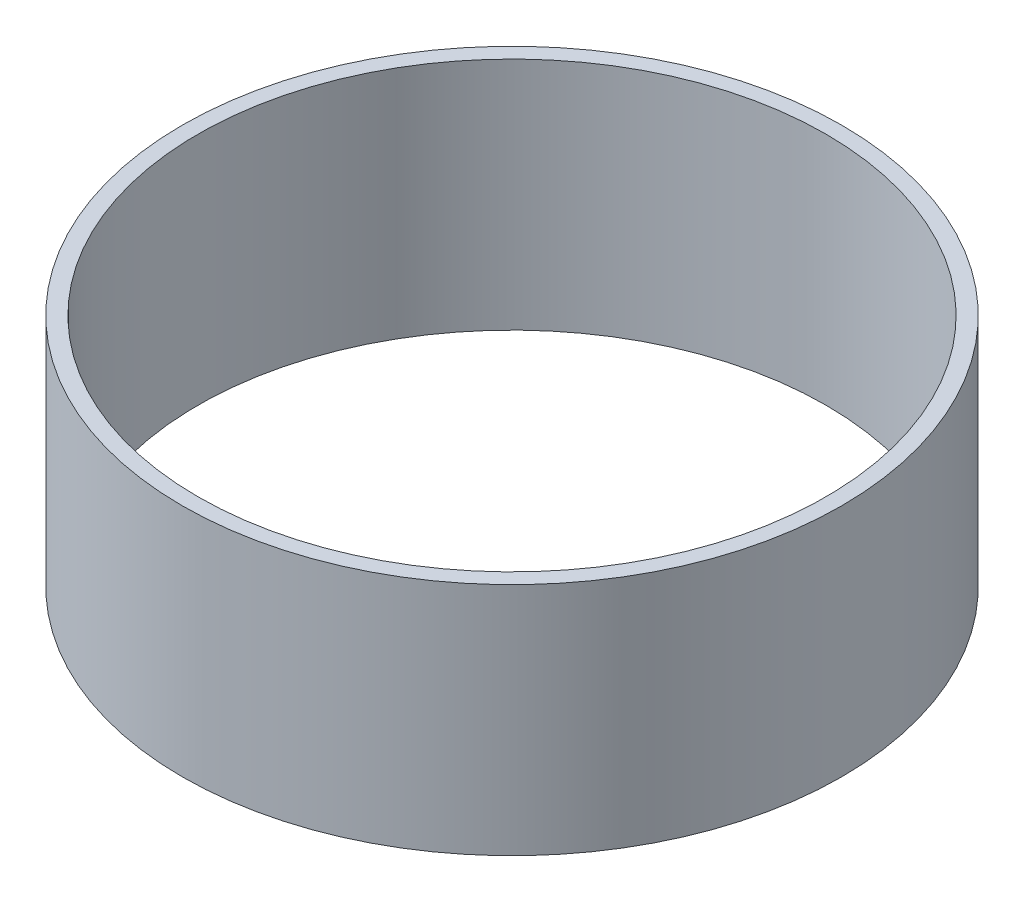
ISO-10303-21;
HEADER;
FILE_DESCRIPTION(('STEP AP214'),'2;1');
FILE_NAME('part.step','',(''),(''),'','','');
FILE_SCHEMA(('AUTOMOTIVE_DESIGN { 1 0 10303 214 1 1 1 1 }'));
ENDSEC;
DATA;
#1=APPLICATION_CONTEXT('core data for automotive mechanical design processes');
#2=APPLICATION_PROTOCOL_DEFINITION('international standard','automotive_design',2000,#1);
#3=PRODUCT_CONTEXT('',#1,'mechanical');
#4=PRODUCT('Part','Part','',(#3));
#5=PRODUCT_RELATED_PRODUCT_CATEGORY('part','',(#4));
#6=PRODUCT_DEFINITION_FORMATION('','',#4);
#7=PRODUCT_DEFINITION_CONTEXT('part definition',#1,'design');
#8=PRODUCT_DEFINITION('design','',#6,#7);
#9=PRODUCT_DEFINITION_SHAPE('','',#8);
#10=(LENGTH_UNIT() NAMED_UNIT(*) SI_UNIT(.MILLI.,.METRE.));
#11=(NAMED_UNIT(*) PLANE_ANGLE_UNIT() SI_UNIT($,.RADIAN.));
#12=(NAMED_UNIT(*) SI_UNIT($,.STERADIAN.) SOLID_ANGLE_UNIT());
#13=UNCERTAINTY_MEASURE_WITH_UNIT(LENGTH_MEASURE(1.E-05),#10,'distance_accuracy_value','');
#14=(GEOMETRIC_REPRESENTATION_CONTEXT(3) GLOBAL_UNCERTAINTY_ASSIGNED_CONTEXT((#13)) GLOBAL_UNIT_ASSIGNED_CONTEXT((#10,
#11,#12)) REPRESENTATION_CONTEXT('',''));
#15=CARTESIAN_POINT('',(0.,0.,0.));
#16=DIRECTION('',(0.,0.,1.));
#17=DIRECTION('',(1.,0.,0.));
#18=AXIS2_PLACEMENT_3D('',#15,#16,#17);
#19=CARTESIAN_POINT('',(0.,15.,0.));
#20=DIRECTION('',(0.,1.,0.));
#21=DIRECTION('',(0.,0.,1.));
#22=AXIS2_PLACEMENT_3D('',#19,#20,#21);
#23=PLANE('',#22);
#24=CARTESIAN_POINT('',(0.,15.,0.));
#25=DIRECTION('',(0.,1.,0.));
#26=DIRECTION('',(0.,0.,1.));
#27=AXIS2_PLACEMENT_3D('',#24,#25,#26);
#28=CIRCLE('',#27,21.066);
#29=CARTESIAN_POINT('',(0.,15.,21.066));
#30=VERTEX_POINT('',#29);
#31=EDGE_CURVE('E10',#30,#30,#28,.T.);
#32=ORIENTED_EDGE('',*,*,#31,.T.);
#33=EDGE_LOOP('',(#32));
#34=FACE_BOUND('',#33,.T.);
#35=CARTESIAN_POINT('',(0.,15.,0.));
#36=DIRECTION('',(0.,1.,0.));
#37=DIRECTION('',(0.,0.,1.));
#38=AXIS2_PLACEMENT_3D('',#35,#36,#37);
#39=CIRCLE('',#38,20.066);
#40=CARTESIAN_POINT('',(0.,15.,20.066));
#41=VERTEX_POINT('',#40);
#42=EDGE_CURVE('E42',#41,#41,#39,.T.);
#43=ORIENTED_EDGE('',*,*,#42,.F.);
#44=EDGE_LOOP('',(#43));
#45=FACE_BOUND('',#44,.T.);
#46=ADVANCED_FACE('F31',(#34,#45),#23,.T.);
#47=CARTESIAN_POINT('',(0.,0.,0.));
#48=DIRECTION('',(0.,1.,0.));
#49=DIRECTION('',(0.,0.,1.));
#50=AXIS2_PLACEMENT_3D('',#47,#48,#49);
#51=PLANE('',#50);
#52=CARTESIAN_POINT('',(0.,0.,0.));
#53=DIRECTION('',(0.,1.,0.));
#54=DIRECTION('',(0.,0.,1.));
#55=AXIS2_PLACEMENT_3D('',#52,#53,#54);
#56=CIRCLE('',#55,21.066);
#57=CARTESIAN_POINT('',(0.,0.,21.066));
#58=VERTEX_POINT('',#57);
#59=EDGE_CURVE('E35',#58,#58,#56,.T.);
#60=ORIENTED_EDGE('',*,*,#59,.F.);
#61=EDGE_LOOP('',(#60));
#62=FACE_BOUND('',#61,.T.);
#63=CARTESIAN_POINT('',(0.,0.,0.));
#64=DIRECTION('',(0.,1.,0.));
#65=DIRECTION('',(0.,0.,1.));
#66=AXIS2_PLACEMENT_3D('',#63,#64,#65);
#67=CIRCLE('',#66,20.066);
#68=CARTESIAN_POINT('',(0.,0.,20.066));
#69=VERTEX_POINT('',#68);
#70=EDGE_CURVE('E44',#69,#69,#67,.T.);
#71=ORIENTED_EDGE('',*,*,#70,.T.);
#72=EDGE_LOOP('',(#71));
#73=FACE_BOUND('',#72,.T.);
#74=ADVANCED_FACE('F54',(#62,#73),#51,.F.);
#75=CARTESIAN_POINT('',(0.,15.,0.));
#76=DIRECTION('',(0.,-1.,0.));
#77=DIRECTION('',(0.,0.,-1.));
#78=AXIS2_PLACEMENT_3D('',#75,#76,#77);
#79=CYLINDRICAL_SURFACE('',#78,21.066);
#80=ORIENTED_EDGE('',*,*,#31,.F.);
#81=EDGE_LOOP('',(#80));
#82=FACE_BOUND('',#81,.T.);
#83=ORIENTED_EDGE('',*,*,#59,.T.);
#84=EDGE_LOOP('',(#83));
#85=FACE_BOUND('',#84,.T.);
#86=ADVANCED_FACE('F33',(#82,#85),#79,.T.);
#87=CARTESIAN_POINT('',(0.,15.,0.));
#88=DIRECTION('',(0.,-1.,0.));
#89=DIRECTION('',(0.,0.,-1.));
#90=AXIS2_PLACEMENT_3D('',#87,#88,#89);
#91=CYLINDRICAL_SURFACE('',#90,20.066);
#92=ORIENTED_EDGE('',*,*,#42,.T.);
#93=EDGE_LOOP('',(#92));
#94=FACE_BOUND('',#93,.T.);
#95=ORIENTED_EDGE('',*,*,#70,.F.);
#96=EDGE_LOOP('',(#95));
#97=FACE_BOUND('',#96,.T.);
#98=ADVANCED_FACE('F50',(#94,#97),#91,.F.);
#99=CLOSED_SHELL('',(#46,#74,#86,#98));
#100=MANIFOLD_SOLID_BREP('B2',#99);
#101=ADVANCED_BREP_SHAPE_REPRESENTATION('',(#18,#100),#14);
#102=SHAPE_DEFINITION_REPRESENTATION(#9,#101);
ENDSEC;
END-ISO-10303-21;
